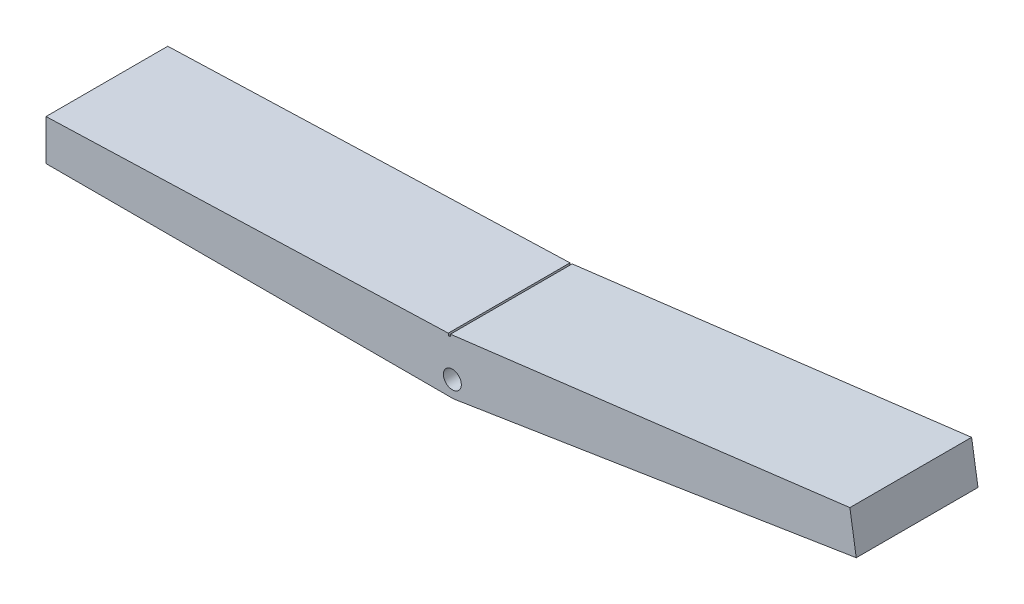
ISO-10303-21;
HEADER;
FILE_DESCRIPTION(('STEP AP214'),'2;1');
FILE_NAME('part.step','',(''),(''),'','','');
FILE_SCHEMA(('AUTOMOTIVE_DESIGN { 1 0 10303 214 1 1 1 1 }'));
ENDSEC;
DATA;
#1=APPLICATION_CONTEXT('core data for automotive mechanical design processes');
#2=APPLICATION_PROTOCOL_DEFINITION('international standard','automotive_design',2000,#1);
#3=PRODUCT_CONTEXT('',#1,'mechanical');
#4=PRODUCT('Part','Part','',(#3));
#5=PRODUCT_RELATED_PRODUCT_CATEGORY('part','',(#4));
#6=PRODUCT_DEFINITION_FORMATION('','',#4);
#7=PRODUCT_DEFINITION_CONTEXT('part definition',#1,'design');
#8=PRODUCT_DEFINITION('design','',#6,#7);
#9=PRODUCT_DEFINITION_SHAPE('','',#8);
#10=(LENGTH_UNIT() NAMED_UNIT(*) SI_UNIT(.MILLI.,.METRE.));
#11=(NAMED_UNIT(*) PLANE_ANGLE_UNIT() SI_UNIT($,.RADIAN.));
#12=(NAMED_UNIT(*) SI_UNIT($,.STERADIAN.) SOLID_ANGLE_UNIT());
#13=UNCERTAINTY_MEASURE_WITH_UNIT(LENGTH_MEASURE(1.E-05),#10,'distance_accuracy_value','');
#14=(GEOMETRIC_REPRESENTATION_CONTEXT(3) GLOBAL_UNCERTAINTY_ASSIGNED_CONTEXT((#13)) GLOBAL_UNIT_ASSIGNED_CONTEXT((#10,
#11,#12)) REPRESENTATION_CONTEXT('',''));
#15=CARTESIAN_POINT('',(0.,0.,0.));
#16=DIRECTION('',(0.,0.,1.));
#17=DIRECTION('',(1.,0.,0.));
#18=AXIS2_PLACEMENT_3D('',#15,#16,#17);
#19=CARTESIAN_POINT('',(0.,0.,22.4));
#20=DIRECTION('',(0.,0.,-1.));
#21=DIRECTION('',(-1.,0.,0.));
#22=AXIS2_PLACEMENT_3D('',#19,#20,#21);
#23=PLANE('',#22);
#24=DIRECTION('',(0.999433081265688,0.0336677304220735,0.));
#25=VECTOR('',#24,1.);
#26=CARTESIAN_POINT('',(0.0673941711974958,9.62855550843816,22.4));
#27=LINE('',#26,#25);
#28=CARTESIAN_POINT('',(-0.955689781170546,9.59409105518646,22.4));
#29=VERTEX_POINT('',#28);
#30=CARTESIAN_POINT('',(-0.555513852549384,9.6075717129101,22.4));
#31=VERTEX_POINT('',#30);
#32=EDGE_CURVE('E217',#29,#31,#27,.T.);
#33=ORIENTED_EDGE('',*,*,#32,.F.);
#34=DIRECTION('',(-0.0784590957278451,0.996917333733128,0.));
#35=VECTOR('',#34,1.);
#36=CARTESIAN_POINT('',(0.835047595490719,-13.1593846813919,22.4));
#37=LINE('',#36,#35);
#38=CARTESIAN_POINT('',(-0.987105032556766,9.99325967113818,22.4));
#39=VERTEX_POINT('',#38);
#40=EDGE_CURVE('E214',#29,#39,#37,.T.);
#41=ORIENTED_EDGE('',*,*,#40,.T.);
#42=DIRECTION('',(-0.999433081265688,-0.0336677304220735,0.));
#43=VECTOR('',#42,1.);
#44=CARTESIAN_POINT('',(-0.787017068246123,10.,22.4));
#45=LINE('',#44,#43);
#46=CARTESIAN_POINT('',(-75.,7.49999999999999,22.4));
#47=VERTEX_POINT('',#46);
#48=EDGE_CURVE('E132',#39,#47,#45,.T.);
#49=ORIENTED_EDGE('',*,*,#48,.T.);
#50=DIRECTION('',(0.,1.,0.));
#51=VECTOR('',#50,1.);
#52=CARTESIAN_POINT('',(-75.,0.,22.4));
#53=LINE('',#52,#51);
#54=CARTESIAN_POINT('',(-75.,0.,22.4));
#55=VERTEX_POINT('',#54);
#56=EDGE_CURVE('E175',#55,#47,#53,.T.);
#57=ORIENTED_EDGE('',*,*,#56,.F.);
#58=DIRECTION('',(-1.,0.,0.));
#59=VECTOR('',#58,1.);
#60=CARTESIAN_POINT('',(0.,0.,22.4));
#61=LINE('',#60,#59);
#62=CARTESIAN_POINT('',(0.,0.,22.4));
#63=VERTEX_POINT('',#62);
#64=EDGE_CURVE('E160',#63,#55,#61,.T.);
#65=ORIENTED_EDGE('',*,*,#64,.F.);
#66=DIRECTION('',(0.987688340595138,0.156434465040231,0.));
#67=VECTOR('',#66,1.);
#68=CARTESIAN_POINT('',(0.,0.,22.4));
#69=LINE('',#68,#67);
#70=CARTESIAN_POINT('',(74.0766255446353,11.7325848780173,22.4));
#71=VERTEX_POINT('',#70);
#72=EDGE_CURVE('E138',#63,#71,#69,.T.);
#73=ORIENTED_EDGE('',*,*,#72,.T.);
#74=DIRECTION('',(-0.15643446504023,0.987688340595138,0.));
#75=VECTOR('',#74,1.);
#76=CARTESIAN_POINT('',(74.0766255446353,11.7325848780173,22.4));
#77=LINE('',#76,#75);
#78=CARTESIAN_POINT('',(72.9033670568336,19.1402474324809,22.4));
#79=VERTEX_POINT('',#78);
#80=EDGE_CURVE('E131',#71,#79,#77,.T.);
#81=ORIENTED_EDGE('',*,*,#80,.T.);
#82=DIRECTION('',(0.992395194968888,0.123092554619126,0.));
#83=VECTOR('',#82,1.);
#84=CARTESIAN_POINT('',(-0.787017068246123,10.,22.4));
#85=LINE('',#84,#83);
#86=CARTESIAN_POINT('',(-0.588338099063515,10.0246433094293,22.4));
#87=VERTEX_POINT('',#86);
#88=EDGE_CURVE('E121',#87,#79,#85,.T.);
#89=ORIENTED_EDGE('',*,*,#88,.F.);
#90=DIRECTION('',(-0.0784590957278451,0.996917333733128,0.));
#91=VECTOR('',#90,1.);
#92=CARTESIAN_POINT('',(1.23381452898397,-13.1280010431008,22.4));
#93=LINE('',#92,#91);
#94=EDGE_CURVE('E218',#31,#87,#93,.T.);
#95=ORIENTED_EDGE('',*,*,#94,.F.);
#96=EDGE_LOOP('',(#33,#41,#49,#57,#65,#73,#81,#89,#95));
#97=FACE_BOUND('',#96,.T.);
#98=CARTESIAN_POINT('',(-0.235377287183517,2.99075200119939,22.4));
#99=DIRECTION('',(0.,0.,1.));
#100=DIRECTION('',(1.,0.,0.));
#101=AXIS2_PLACEMENT_3D('',#98,#99,#100);
#102=CIRCLE('',#101,1.65);
#103=CARTESIAN_POINT('',(1.41462271281648,2.99075200119939,22.4));
#104=VERTEX_POINT('',#103);
#105=EDGE_CURVE('E172',#104,#104,#102,.T.);
#106=ORIENTED_EDGE('',*,*,#105,.F.);
#107=EDGE_LOOP('',(#106));
#108=FACE_BOUND('',#107,.T.);
#109=ADVANCED_FACE('F57',(#97,#108),#23,.F.);
#110=CARTESIAN_POINT('',(0.,0.,0.));
#111=DIRECTION('',(0.,0.,-1.));
#112=DIRECTION('',(-1.,0.,0.));
#113=AXIS2_PLACEMENT_3D('',#110,#111,#112);
#114=PLANE('',#113);
#115=DIRECTION('',(-0.0784590957278451,0.996917333733128,0.));
#116=VECTOR('',#115,1.);
#117=CARTESIAN_POINT('',(0.835047595490716,-13.1593846813919,0.));
#118=LINE('',#117,#116);
#119=CARTESIAN_POINT('',(-0.955689781170548,9.59409105518646,0.));
#120=VERTEX_POINT('',#119);
#121=CARTESIAN_POINT('',(-0.987105032556768,9.99325967113818,0.));
#122=VERTEX_POINT('',#121);
#123=EDGE_CURVE('E72',#120,#122,#118,.T.);
#124=ORIENTED_EDGE('',*,*,#123,.F.);
#125=DIRECTION('',(-0.999433081265688,-0.0336677304220735,0.));
#126=VECTOR('',#125,1.);
#127=CARTESIAN_POINT('',(0.0673941711974929,9.62855550843816,0.));
#128=LINE('',#127,#126);
#129=CARTESIAN_POINT('',(-0.555513852549389,9.6075717129101,0.));
#130=VERTEX_POINT('',#129);
#131=EDGE_CURVE('E213',#130,#120,#128,.T.);
#132=ORIENTED_EDGE('',*,*,#131,.F.);
#133=DIRECTION('',(-0.0784590957278451,0.996917333733128,0.));
#134=VECTOR('',#133,1.);
#135=CARTESIAN_POINT('',(1.23381452898397,-13.1280010431008,0.));
#136=LINE('',#135,#134);
#137=CARTESIAN_POINT('',(-0.58833809906352,10.0246433094293,0.));
#138=VERTEX_POINT('',#137);
#139=EDGE_CURVE('E200',#130,#138,#136,.T.);
#140=ORIENTED_EDGE('',*,*,#139,.T.);
#141=DIRECTION('',(0.992395194968888,0.123092554619126,0.));
#142=VECTOR('',#141,1.);
#143=CARTESIAN_POINT('',(-0.787017068246123,10.,0.));
#144=LINE('',#143,#142);
#145=CARTESIAN_POINT('',(72.9033670568336,19.1402474324809,0.));
#146=VERTEX_POINT('',#145);
#147=EDGE_CURVE('E162',#138,#146,#144,.T.);
#148=ORIENTED_EDGE('',*,*,#147,.T.);
#149=DIRECTION('',(-0.15643446504023,0.987688340595138,0.));
#150=VECTOR('',#149,1.);
#151=CARTESIAN_POINT('',(74.0766255446353,11.7325848780173,0.));
#152=LINE('',#151,#150);
#153=CARTESIAN_POINT('',(74.0766255446353,11.7325848780173,0.));
#154=VERTEX_POINT('',#153);
#155=EDGE_CURVE('E145',#154,#146,#152,.T.);
#156=ORIENTED_EDGE('',*,*,#155,.F.);
#157=DIRECTION('',(0.987688340595138,0.156434465040231,0.));
#158=VECTOR('',#157,1.);
#159=CARTESIAN_POINT('',(0.,0.,0.));
#160=LINE('',#159,#158);
#161=CARTESIAN_POINT('',(0.,0.,0.));
#162=VERTEX_POINT('',#161);
#163=EDGE_CURVE('E158',#162,#154,#160,.T.);
#164=ORIENTED_EDGE('',*,*,#163,.F.);
#165=DIRECTION('',(-1.,0.,0.));
#166=VECTOR('',#165,1.);
#167=CARTESIAN_POINT('',(0.,0.,0.));
#168=LINE('',#167,#166);
#169=CARTESIAN_POINT('',(-75.,0.,0.));
#170=VERTEX_POINT('',#169);
#171=EDGE_CURVE('E169',#162,#170,#168,.T.);
#172=ORIENTED_EDGE('',*,*,#171,.T.);
#173=DIRECTION('',(0.,1.,0.));
#174=VECTOR('',#173,1.);
#175=CARTESIAN_POINT('',(-75.,0.,0.));
#176=LINE('',#175,#174);
#177=CARTESIAN_POINT('',(-75.,7.49999999999999,0.));
#178=VERTEX_POINT('',#177);
#179=EDGE_CURVE('E166',#170,#178,#176,.T.);
#180=ORIENTED_EDGE('',*,*,#179,.T.);
#181=DIRECTION('',(-0.999433081265688,-0.0336677304220735,0.));
#182=VECTOR('',#181,1.);
#183=CARTESIAN_POINT('',(-0.787017068246123,10.,0.));
#184=LINE('',#183,#182);
#185=EDGE_CURVE('E164',#122,#178,#184,.T.);
#186=ORIENTED_EDGE('',*,*,#185,.F.);
#187=EDGE_LOOP('',(#124,#132,#140,#148,#156,#164,#172,#180,#186));
#188=FACE_BOUND('',#187,.T.);
#189=CARTESIAN_POINT('',(-0.235377287183517,2.99075200119939,0.));
#190=DIRECTION('',(0.,0.,1.));
#191=DIRECTION('',(1.,0.,0.));
#192=AXIS2_PLACEMENT_3D('',#189,#190,#191);
#193=CIRCLE('',#192,1.65);
#194=CARTESIAN_POINT('',(1.41462271281648,2.99075200119939,0.));
#195=VERTEX_POINT('',#194);
#196=EDGE_CURVE('E178',#195,#195,#193,.T.);
#197=ORIENTED_EDGE('',*,*,#196,.T.);
#198=EDGE_LOOP('',(#197));
#199=FACE_BOUND('',#198,.T.);
#200=ADVANCED_FACE('F238',(#188,#199),#114,.T.);
#201=CARTESIAN_POINT('',(0.,0.,22.4));
#202=DIRECTION('',(0.,-1.,0.));
#203=DIRECTION('',(1.,0.,0.));
#204=AXIS2_PLACEMENT_3D('',#201,#202,#203);
#205=PLANE('',#204);
#206=CARTESIAN_POINT('',(-67.,0.,14.7));
#207=DIRECTION('',(0.,1.,0.));
#208=DIRECTION('',(-1.,0.,0.));
#209=AXIS2_PLACEMENT_3D('',#206,#207,#208);
#210=CIRCLE('',#209,3.05);
#211=CARTESIAN_POINT('',(-70.05,0.,14.7));
#212=VERTEX_POINT('',#211);
#213=EDGE_CURVE('E203',#212,#212,#210,.T.);
#214=ORIENTED_EDGE('',*,*,#213,.T.);
#215=EDGE_LOOP('',(#214));
#216=FACE_BOUND('',#215,.T.);
#217=CARTESIAN_POINT('',(-67.,0.,7.7));
#218=DIRECTION('',(0.,1.,0.));
#219=DIRECTION('',(-1.,0.,0.));
#220=AXIS2_PLACEMENT_3D('',#217,#218,#219);
#221=CIRCLE('',#220,3.05);
#222=CARTESIAN_POINT('',(-70.05,0.,7.7));
#223=VERTEX_POINT('',#222);
#224=EDGE_CURVE('E196',#223,#223,#221,.T.);
#225=ORIENTED_EDGE('',*,*,#224,.T.);
#226=EDGE_LOOP('',(#225));
#227=FACE_BOUND('',#226,.T.);
#228=ORIENTED_EDGE('',*,*,#171,.F.);
#229=DIRECTION('',(0.,0.,-1.));
#230=VECTOR('',#229,1.);
#231=CARTESIAN_POINT('',(0.,0.,22.4));
#232=LINE('',#231,#230);
#233=EDGE_CURVE('E81',#63,#162,#232,.T.);
#234=ORIENTED_EDGE('',*,*,#233,.F.);
#235=ORIENTED_EDGE('',*,*,#64,.T.);
#236=DIRECTION('',(0.,0.,-1.));
#237=VECTOR('',#236,1.);
#238=CARTESIAN_POINT('',(-75.,0.,22.4));
#239=LINE('',#238,#237);
#240=EDGE_CURVE('E110',#55,#170,#239,.T.);
#241=ORIENTED_EDGE('',*,*,#240,.T.);
#242=EDGE_LOOP('',(#228,#234,#235,#241));
#243=FACE_BOUND('',#242,.T.);
#244=ADVANCED_FACE('F59',(#216,#227,#243),#205,.T.);
#245=CARTESIAN_POINT('',(0.,0.,22.4));
#246=DIRECTION('',(-0.156434465040231,0.987688340595138,0.));
#247=DIRECTION('',(-0.987688340595138,-0.156434465040231,0.));
#248=AXIS2_PLACEMENT_3D('',#245,#246,#247);
#249=PLANE('',#248);
#250=CARTESIAN_POINT('',(66.1751188198742,10.4811091576955,14.7));
#251=DIRECTION('',(0.156434465040231,-0.987688340595138,0.));
#252=DIRECTION('',(0.987688340595138,0.156434465040231,0.));
#253=AXIS2_PLACEMENT_3D('',#250,#251,#252);
#254=CIRCLE('',#253,3.05);
#255=CARTESIAN_POINT('',(69.1875682586894,10.9582342760682,14.7));
#256=VERTEX_POINT('',#255);
#257=EDGE_CURVE('E191',#256,#256,#254,.T.);
#258=ORIENTED_EDGE('',*,*,#257,.F.);
#259=EDGE_LOOP('',(#258));
#260=FACE_BOUND('',#259,.T.);
#261=CARTESIAN_POINT('',(66.1751188198742,10.4811091576955,7.7));
#262=DIRECTION('',(0.156434465040231,-0.987688340595138,0.));
#263=DIRECTION('',(0.987688340595138,0.156434465040231,0.));
#264=AXIS2_PLACEMENT_3D('',#261,#262,#263);
#265=CIRCLE('',#264,3.05);
#266=CARTESIAN_POINT('',(69.1875682586894,10.9582342760682,7.7));
#267=VERTEX_POINT('',#266);
#268=EDGE_CURVE('E184',#267,#267,#265,.T.);
#269=ORIENTED_EDGE('',*,*,#268,.F.);
#270=EDGE_LOOP('',(#269));
#271=FACE_BOUND('',#270,.T.);
#272=ORIENTED_EDGE('',*,*,#163,.T.);
#273=DIRECTION('',(0.,0.,-1.));
#274=VECTOR('',#273,1.);
#275=CARTESIAN_POINT('',(74.0766255446353,11.7325848780173,22.4));
#276=LINE('',#275,#274);
#277=EDGE_CURVE('E146',#71,#154,#276,.T.);
#278=ORIENTED_EDGE('',*,*,#277,.F.);
#279=ORIENTED_EDGE('',*,*,#72,.F.);
#280=ORIENTED_EDGE('',*,*,#233,.T.);
#281=EDGE_LOOP('',(#272,#278,#279,#280));
#282=FACE_BOUND('',#281,.T.);
#283=ADVANCED_FACE('F243',(#260,#271,#282),#249,.F.);
#284=CARTESIAN_POINT('',(74.0766255446353,11.7325848780173,22.4));
#285=DIRECTION('',(-0.987688340595138,-0.15643446504023,0.));
#286=DIRECTION('',(0.15643446504023,-0.987688340595138,0.));
#287=AXIS2_PLACEMENT_3D('',#284,#285,#286);
#288=PLANE('',#287);
#289=ORIENTED_EDGE('',*,*,#155,.T.);
#290=DIRECTION('',(0.,0.,-1.));
#291=VECTOR('',#290,1.);
#292=CARTESIAN_POINT('',(72.9033670568336,19.1402474324809,22.4));
#293=LINE('',#292,#291);
#294=EDGE_CURVE('E126',#79,#146,#293,.T.);
#295=ORIENTED_EDGE('',*,*,#294,.F.);
#296=ORIENTED_EDGE('',*,*,#80,.F.);
#297=ORIENTED_EDGE('',*,*,#277,.T.);
#298=EDGE_LOOP('',(#289,#295,#296,#297));
#299=FACE_BOUND('',#298,.T.);
#300=ADVANCED_FACE('F143',(#299),#288,.F.);
#301=CARTESIAN_POINT('',(-0.787017068246123,10.,22.4));
#302=DIRECTION('',(-0.123092554619126,0.992395194968888,0.));
#303=DIRECTION('',(-0.992395194968888,-0.123092554619126,0.));
#304=AXIS2_PLACEMENT_3D('',#301,#302,#303);
#305=PLANE('',#304);
#306=DIRECTION('',(0.,0.,-1.));
#307=VECTOR('',#306,1.);
#308=CARTESIAN_POINT('',(-0.588338099063515,10.0246433094293,22.4));
#309=LINE('',#308,#307);
#310=EDGE_CURVE('E14',#87,#138,#309,.T.);
#311=ORIENTED_EDGE('',*,*,#310,.F.);
#312=ORIENTED_EDGE('',*,*,#88,.T.);
#313=ORIENTED_EDGE('',*,*,#294,.T.);
#314=ORIENTED_EDGE('',*,*,#147,.F.);
#315=EDGE_LOOP('',(#311,#312,#313,#314));
#316=FACE_BOUND('',#315,.T.);
#317=ADVANCED_FACE('F123',(#316),#305,.T.);
#318=CARTESIAN_POINT('',(-0.787017068246123,10.,22.4));
#319=DIRECTION('',(0.0336677304220735,-0.999433081265688,0.));
#320=DIRECTION('',(0.999433081265688,0.0336677304220735,0.));
#321=AXIS2_PLACEMENT_3D('',#318,#319,#320);
#322=PLANE('',#321);
#323=ORIENTED_EDGE('',*,*,#48,.F.);
#324=DIRECTION('',(0.,0.,-1.));
#325=VECTOR('',#324,1.);
#326=CARTESIAN_POINT('',(-0.987105032556766,9.99325967113818,22.4));
#327=LINE('',#326,#325);
#328=EDGE_CURVE('E65',#39,#122,#327,.T.);
#329=ORIENTED_EDGE('',*,*,#328,.T.);
#330=ORIENTED_EDGE('',*,*,#185,.T.);
#331=DIRECTION('',(0.,0.,-1.));
#332=VECTOR('',#331,1.);
#333=CARTESIAN_POINT('',(-75.,7.49999999999999,22.4));
#334=LINE('',#333,#332);
#335=EDGE_CURVE('E147',#47,#178,#334,.T.);
#336=ORIENTED_EDGE('',*,*,#335,.F.);
#337=EDGE_LOOP('',(#323,#329,#330,#336));
#338=FACE_BOUND('',#337,.T.);
#339=ADVANCED_FACE('F241',(#338),#322,.F.);
#340=CARTESIAN_POINT('',(-75.,0.,22.4));
#341=DIRECTION('',(-1.,0.,0.));
#342=DIRECTION('',(0.,0.,1.));
#343=AXIS2_PLACEMENT_3D('',#340,#341,#342);
#344=PLANE('',#343);
#345=ORIENTED_EDGE('',*,*,#179,.F.);
#346=ORIENTED_EDGE('',*,*,#240,.F.);
#347=ORIENTED_EDGE('',*,*,#56,.T.);
#348=ORIENTED_EDGE('',*,*,#335,.T.);
#349=EDGE_LOOP('',(#345,#346,#347,#348));
#350=FACE_BOUND('',#349,.T.);
#351=ADVANCED_FACE('F242',(#350),#344,.T.);
#352=CARTESIAN_POINT('',(-0.235377287183517,2.99075200119939,22.4));
#353=DIRECTION('',(0.,0.,-1.));
#354=DIRECTION('',(-1.,0.,0.));
#355=AXIS2_PLACEMENT_3D('',#352,#353,#354);
#356=CYLINDRICAL_SURFACE('',#355,1.65);
#357=ORIENTED_EDGE('',*,*,#105,.T.);
#358=EDGE_LOOP('',(#357));
#359=FACE_BOUND('',#358,.T.);
#360=ORIENTED_EDGE('',*,*,#196,.F.);
#361=EDGE_LOOP('',(#360));
#362=FACE_BOUND('',#361,.T.);
#363=ADVANCED_FACE('F262',(#359,#362),#356,.F.);
#364=CARTESIAN_POINT('',(65.7058154247536,13.4441741794809,7.7));
#365=DIRECTION('',(0.156434465040231,-0.987688340595138,0.));
#366=DIRECTION('',(0.987688340595138,0.156434465040231,0.));
#367=AXIS2_PLACEMENT_3D('',#364,#365,#366);
#368=CYLINDRICAL_SURFACE('',#367,3.05);
#369=CARTESIAN_POINT('',(65.7058154247536,13.4441741794809,7.7));
#370=DIRECTION('',(0.156434465040231,-0.987688340595138,0.));
#371=DIRECTION('',(0.987688340595138,0.156434465040231,0.));
#372=AXIS2_PLACEMENT_3D('',#369,#370,#371);
#373=CIRCLE('',#372,3.05);
#374=CARTESIAN_POINT('',(68.7182648635687,13.9212992978536,7.7));
#375=VERTEX_POINT('',#374);
#376=EDGE_CURVE('E187',#375,#375,#373,.T.);
#377=ORIENTED_EDGE('',*,*,#376,.F.);
#378=EDGE_LOOP('',(#377));
#379=FACE_BOUND('',#378,.T.);
#380=ORIENTED_EDGE('',*,*,#268,.T.);
#381=EDGE_LOOP('',(#380));
#382=FACE_BOUND('',#381,.T.);
#383=ADVANCED_FACE('F265',(#379,#382),#368,.F.);
#384=CARTESIAN_POINT('',(65.7058154247536,13.4441741794809,7.7));
#385=DIRECTION('',(0.156434465040231,-0.987688340595138,0.));
#386=DIRECTION('',(0.987688340595138,0.156434465040231,0.));
#387=AXIS2_PLACEMENT_3D('',#384,#385,#386);
#388=PLANE('',#387);
#389=ORIENTED_EDGE('',*,*,#376,.T.);
#390=EDGE_LOOP('',(#389));
#391=FACE_BOUND('',#390,.T.);
#392=ADVANCED_FACE('F269',(#391),#388,.T.);
#393=CARTESIAN_POINT('',(65.7058154247536,13.4441741794809,14.7));
#394=DIRECTION('',(0.156434465040231,-0.987688340595138,0.));
#395=DIRECTION('',(0.987688340595138,0.156434465040231,0.));
#396=AXIS2_PLACEMENT_3D('',#393,#394,#395);
#397=CYLINDRICAL_SURFACE('',#396,3.05);
#398=CARTESIAN_POINT('',(65.7058154247536,13.4441741794809,14.7));
#399=DIRECTION('',(0.156434465040231,-0.987688340595138,0.));
#400=DIRECTION('',(0.987688340595138,0.156434465040231,0.));
#401=AXIS2_PLACEMENT_3D('',#398,#399,#400);
#402=CIRCLE('',#401,3.05);
#403=CARTESIAN_POINT('',(68.7182648635687,13.9212992978536,14.7));
#404=VERTEX_POINT('',#403);
#405=EDGE_CURVE('E181',#404,#404,#402,.T.);
#406=ORIENTED_EDGE('',*,*,#405,.F.);
#407=EDGE_LOOP('',(#406));
#408=FACE_BOUND('',#407,.T.);
#409=ORIENTED_EDGE('',*,*,#257,.T.);
#410=EDGE_LOOP('',(#409));
#411=FACE_BOUND('',#410,.T.);
#412=ADVANCED_FACE('F273',(#408,#411),#397,.F.);
#413=CARTESIAN_POINT('',(65.7058154247536,13.4441741794809,14.7));
#414=DIRECTION('',(0.156434465040231,-0.987688340595138,0.));
#415=DIRECTION('',(0.987688340595138,0.156434465040231,0.));
#416=AXIS2_PLACEMENT_3D('',#413,#414,#415);
#417=PLANE('',#416);
#418=ORIENTED_EDGE('',*,*,#405,.T.);
#419=EDGE_LOOP('',(#418));
#420=FACE_BOUND('',#419,.T.);
#421=ADVANCED_FACE('F277',(#420),#417,.T.);
#422=CARTESIAN_POINT('',(-67.,3.00000000000001,7.7));
#423=DIRECTION('',(0.,-1.,0.));
#424=DIRECTION('',(1.,0.,0.));
#425=AXIS2_PLACEMENT_3D('',#422,#423,#424);
#426=CYLINDRICAL_SURFACE('',#425,3.05);
#427=CARTESIAN_POINT('',(-67.,3.00000000000001,7.7));
#428=DIRECTION('',(0.,1.,0.));
#429=DIRECTION('',(-1.,0.,0.));
#430=AXIS2_PLACEMENT_3D('',#427,#428,#429);
#431=CIRCLE('',#430,3.05);
#432=CARTESIAN_POINT('',(-70.05,3.00000000000001,7.7));
#433=VERTEX_POINT('',#432);
#434=EDGE_CURVE('E199',#433,#433,#431,.T.);
#435=ORIENTED_EDGE('',*,*,#434,.T.);
#436=EDGE_LOOP('',(#435));
#437=FACE_BOUND('',#436,.T.);
#438=ORIENTED_EDGE('',*,*,#224,.F.);
#439=EDGE_LOOP('',(#438));
#440=FACE_BOUND('',#439,.T.);
#441=ADVANCED_FACE('F281',(#437,#440),#426,.F.);
#442=CARTESIAN_POINT('',(-67.,3.00000000000001,7.7));
#443=DIRECTION('',(0.,-1.,0.));
#444=DIRECTION('',(-1.,0.,0.));
#445=AXIS2_PLACEMENT_3D('',#442,#443,#444);
#446=PLANE('',#445);
#447=ORIENTED_EDGE('',*,*,#434,.F.);
#448=EDGE_LOOP('',(#447));
#449=FACE_BOUND('',#448,.T.);
#450=ADVANCED_FACE('F285',(#449),#446,.T.);
#451=CARTESIAN_POINT('',(-67.,3.00000000000001,14.7));
#452=DIRECTION('',(0.,-1.,0.));
#453=DIRECTION('',(1.,0.,0.));
#454=AXIS2_PLACEMENT_3D('',#451,#452,#453);
#455=CYLINDRICAL_SURFACE('',#454,3.05);
#456=CARTESIAN_POINT('',(-67.,3.00000000000001,14.7));
#457=DIRECTION('',(0.,1.,0.));
#458=DIRECTION('',(-1.,0.,0.));
#459=AXIS2_PLACEMENT_3D('',#456,#457,#458);
#460=CIRCLE('',#459,3.05);
#461=CARTESIAN_POINT('',(-70.05,3.00000000000001,14.7));
#462=VERTEX_POINT('',#461);
#463=EDGE_CURVE('E188',#462,#462,#460,.T.);
#464=ORIENTED_EDGE('',*,*,#463,.T.);
#465=EDGE_LOOP('',(#464));
#466=FACE_BOUND('',#465,.T.);
#467=ORIENTED_EDGE('',*,*,#213,.F.);
#468=EDGE_LOOP('',(#467));
#469=FACE_BOUND('',#468,.T.);
#470=ADVANCED_FACE('F289',(#466,#469),#455,.F.);
#471=CARTESIAN_POINT('',(-67.,3.00000000000001,14.7));
#472=DIRECTION('',(0.,-1.,0.));
#473=DIRECTION('',(-1.,0.,0.));
#474=AXIS2_PLACEMENT_3D('',#471,#472,#473);
#475=PLANE('',#474);
#476=ORIENTED_EDGE('',*,*,#463,.F.);
#477=EDGE_LOOP('',(#476));
#478=FACE_BOUND('',#477,.T.);
#479=ADVANCED_FACE('F293',(#478),#475,.T.);
#480=CARTESIAN_POINT('',(0.835047595490716,-13.1593846813919,0.));
#481=DIRECTION('',(-0.996917333733128,-0.0784590957278451,0.));
#482=DIRECTION('',(0.0784590957278451,-0.996917333733128,0.));
#483=AXIS2_PLACEMENT_3D('',#480,#481,#482);
#484=PLANE('',#483);
#485=ORIENTED_EDGE('',*,*,#40,.F.);
#486=DIRECTION('',(0.,0.,1.));
#487=VECTOR('',#486,1.);
#488=CARTESIAN_POINT('',(-0.955689781170548,9.59409105518646,0.));
#489=LINE('',#488,#487);
#490=EDGE_CURVE('E212',#120,#29,#489,.T.);
#491=ORIENTED_EDGE('',*,*,#490,.F.);
#492=ORIENTED_EDGE('',*,*,#123,.T.);
#493=ORIENTED_EDGE('',*,*,#328,.F.);
#494=EDGE_LOOP('',(#485,#491,#492,#493));
#495=FACE_BOUND('',#494,.T.);
#496=ADVANCED_FACE('F297',(#495),#484,.F.);
#497=CARTESIAN_POINT('',(-0.773549976077294,9.60022676749372,22.4));
#498=DIRECTION('',(0.0336677304220735,-0.999433081265688,0.));
#499=DIRECTION('',(0.999433081265688,0.0336677304220735,0.));
#500=AXIS2_PLACEMENT_3D('',#497,#498,#499);
#501=PLANE('',#500);
#502=DIRECTION('',(0.,0.,-1.));
#503=VECTOR('',#502,1.);
#504=CARTESIAN_POINT('',(-0.555513852549389,9.60757171291009,0.));
#505=LINE('',#504,#503);
#506=EDGE_CURVE('E210',#31,#130,#505,.T.);
#507=ORIENTED_EDGE('',*,*,#506,.T.);
#508=ORIENTED_EDGE('',*,*,#131,.T.);
#509=ORIENTED_EDGE('',*,*,#490,.T.);
#510=ORIENTED_EDGE('',*,*,#32,.T.);
#511=EDGE_LOOP('',(#507,#508,#509,#510));
#512=FACE_BOUND('',#511,.T.);
#513=ADVANCED_FACE('F231',(#512),#501,.F.);
#514=CARTESIAN_POINT('',(1.23381452898397,-13.1280010431008,0.));
#515=DIRECTION('',(0.996917333733128,0.0784590957278451,0.));
#516=DIRECTION('',(-0.0784590957278451,0.996917333733128,0.));
#517=AXIS2_PLACEMENT_3D('',#514,#515,#516);
#518=PLANE('',#517);
#519=ORIENTED_EDGE('',*,*,#310,.T.);
#520=ORIENTED_EDGE('',*,*,#139,.F.);
#521=ORIENTED_EDGE('',*,*,#506,.F.);
#522=ORIENTED_EDGE('',*,*,#94,.T.);
#523=EDGE_LOOP('',(#519,#520,#521,#522));
#524=FACE_BOUND('',#523,.T.);
#525=ADVANCED_FACE('F301',(#524),#518,.F.);
#526=CLOSED_SHELL('',(#109,#200,#244,#283,#300,#317,#339,#351,#363,#383,#392,#412,#421,#441,
#450,#470,#479,#496,#513,#525));
#527=MANIFOLD_SOLID_BREP('B2',#526);
#528=ADVANCED_BREP_SHAPE_REPRESENTATION('',(#18,#527),#14);
#529=SHAPE_DEFINITION_REPRESENTATION(#9,#528);
ENDSEC;
END-ISO-10303-21;
